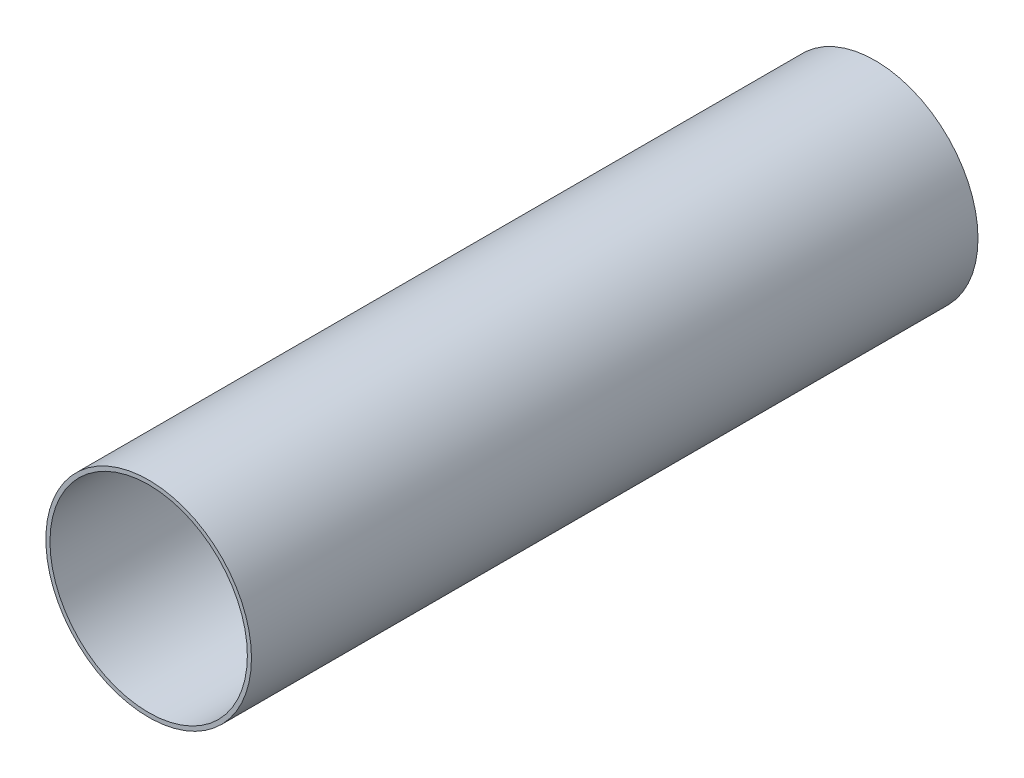
ISO-10303-21;
HEADER;
FILE_DESCRIPTION(('STEP AP214'),'2;1');
FILE_NAME('part.step','',(''),(''),'','','');
FILE_SCHEMA(('AUTOMOTIVE_DESIGN { 1 0 10303 214 1 1 1 1 }'));
ENDSEC;
DATA;
#1=APPLICATION_CONTEXT('core data for automotive mechanical design processes');
#2=APPLICATION_PROTOCOL_DEFINITION('international standard','automotive_design',2000,#1);
#3=PRODUCT_CONTEXT('',#1,'mechanical');
#4=PRODUCT('Part','Part','',(#3));
#5=PRODUCT_RELATED_PRODUCT_CATEGORY('part','',(#4));
#6=PRODUCT_DEFINITION_FORMATION('','',#4);
#7=PRODUCT_DEFINITION_CONTEXT('part definition',#1,'design');
#8=PRODUCT_DEFINITION('design','',#6,#7);
#9=PRODUCT_DEFINITION_SHAPE('','',#8);
#10=(LENGTH_UNIT() NAMED_UNIT(*) SI_UNIT(.MILLI.,.METRE.));
#11=(NAMED_UNIT(*) PLANE_ANGLE_UNIT() SI_UNIT($,.RADIAN.));
#12=(NAMED_UNIT(*) SI_UNIT($,.STERADIAN.) SOLID_ANGLE_UNIT());
#13=UNCERTAINTY_MEASURE_WITH_UNIT(LENGTH_MEASURE(1.E-05),#10,'distance_accuracy_value','');
#14=(GEOMETRIC_REPRESENTATION_CONTEXT(3) GLOBAL_UNCERTAINTY_ASSIGNED_CONTEXT((#13)) GLOBAL_UNIT_ASSIGNED_CONTEXT((#10,
#11,#12)) REPRESENTATION_CONTEXT('',''));
#15=CARTESIAN_POINT('',(0.,0.,0.));
#16=DIRECTION('',(0.,0.,1.));
#17=DIRECTION('',(1.,0.,0.));
#18=AXIS2_PLACEMENT_3D('',#15,#16,#17);
#19=CARTESIAN_POINT('',(-5.32907051820075E-12,6.21724893790088E-12,44.8710883117727));
#20=DIRECTION('',(1.18764013058328E-13,-1.4845501632291E-13,-1.));
#21=DIRECTION('',(0.,1.,-1.4845501632291E-13));
#22=AXIS2_PLACEMENT_3D('',#19,#20,#21);
#23=CYLINDRICAL_SURFACE('',#22,6.35);
#24=CARTESIAN_POINT('',(-5.32907051820075E-12,6.21724893790088E-12,44.8710883117727));
#25=DIRECTION('',(0.,0.,1.));
#26=DIRECTION('',(1.,0.,0.));
#27=AXIS2_PLACEMENT_3D('',#24,#25,#26);
#28=CIRCLE('',#27,6.35);
#29=CARTESIAN_POINT('',(6.34999999999467,6.21724893790088E-12,44.8710883117727));
#30=VERTEX_POINT('',#29);
#31=EDGE_CURVE('E10',#30,#30,#28,.T.);
#32=ORIENTED_EDGE('',*,*,#31,.F.);
#33=EDGE_LOOP('',(#32));
#34=FACE_BOUND('',#33,.T.);
#35=CARTESIAN_POINT('',(0.,-4.44089209850063E-13,0.));
#36=DIRECTION('',(0.,0.,1.));
#37=DIRECTION('',(1.,0.,0.));
#38=AXIS2_PLACEMENT_3D('',#35,#36,#37);
#39=CIRCLE('',#38,6.35);
#40=CARTESIAN_POINT('',(6.35,-4.44089209850063E-13,0.));
#41=VERTEX_POINT('',#40);
#42=EDGE_CURVE('E34',#41,#41,#39,.T.);
#43=ORIENTED_EDGE('',*,*,#42,.T.);
#44=EDGE_LOOP('',(#43));
#45=FACE_BOUND('',#44,.T.);
#46=ADVANCED_FACE('F31',(#34,#45),#23,.T.);
#47=CARTESIAN_POINT('',(-5.32907051820075E-12,6.21724893790088E-12,44.8710883117727));
#48=DIRECTION('',(0.,0.,1.));
#49=DIRECTION('',(1.,0.,0.));
#50=AXIS2_PLACEMENT_3D('',#47,#48,#49);
#51=PLANE('',#50);
#52=CARTESIAN_POINT('',(-5.32907051820075E-12,6.21724893790088E-12,44.8710883117727));
#53=DIRECTION('',(0.,0.,1.));
#54=DIRECTION('',(1.,0.,0.));
#55=AXIS2_PLACEMENT_3D('',#52,#53,#54);
#56=CIRCLE('',#55,6.096);
#57=CARTESIAN_POINT('',(6.09599999999467,6.21724893790088E-12,44.8710883117727));
#58=VERTEX_POINT('',#57);
#59=EDGE_CURVE('E41',#58,#58,#56,.T.);
#60=ORIENTED_EDGE('',*,*,#59,.F.);
#61=EDGE_LOOP('',(#60));
#62=FACE_BOUND('',#61,.T.);
#63=ORIENTED_EDGE('',*,*,#31,.T.);
#64=EDGE_LOOP('',(#63));
#65=FACE_BOUND('',#64,.T.);
#66=ADVANCED_FACE('F52',(#62,#65),#51,.T.);
#67=CARTESIAN_POINT('',(0.,-4.44089209850063E-13,0.));
#68=DIRECTION('',(0.,0.,1.));
#69=DIRECTION('',(1.,0.,0.));
#70=AXIS2_PLACEMENT_3D('',#67,#68,#69);
#71=PLANE('',#70);
#72=CARTESIAN_POINT('',(0.,-4.44089209850063E-13,0.));
#73=DIRECTION('',(0.,0.,1.));
#74=DIRECTION('',(1.,0.,0.));
#75=AXIS2_PLACEMENT_3D('',#72,#73,#74);
#76=CIRCLE('',#75,6.096);
#77=CARTESIAN_POINT('',(6.096,-4.44089209850063E-13,0.));
#78=VERTEX_POINT('',#77);
#79=EDGE_CURVE('E43',#78,#78,#76,.T.);
#80=ORIENTED_EDGE('',*,*,#79,.T.);
#81=EDGE_LOOP('',(#80));
#82=FACE_BOUND('',#81,.T.);
#83=ORIENTED_EDGE('',*,*,#42,.F.);
#84=EDGE_LOOP('',(#83));
#85=FACE_BOUND('',#84,.T.);
#86=ADVANCED_FACE('F54',(#82,#85),#71,.F.);
#87=CARTESIAN_POINT('',(-5.32907051820075E-12,6.21724893790088E-12,44.8710883117727));
#88=DIRECTION('',(1.18764013058328E-13,-1.4845501632291E-13,-1.));
#89=DIRECTION('',(0.,1.,-1.4845501632291E-13));
#90=AXIS2_PLACEMENT_3D('',#87,#88,#89);
#91=CYLINDRICAL_SURFACE('',#90,6.096);
#92=ORIENTED_EDGE('',*,*,#59,.T.);
#93=EDGE_LOOP('',(#92));
#94=FACE_BOUND('',#93,.T.);
#95=ORIENTED_EDGE('',*,*,#79,.F.);
#96=EDGE_LOOP('',(#95));
#97=FACE_BOUND('',#96,.T.);
#98=ADVANCED_FACE('F49',(#94,#97),#91,.F.);
#99=CLOSED_SHELL('',(#46,#66,#86,#98));
#100=MANIFOLD_SOLID_BREP('B2',#99);
#101=ADVANCED_BREP_SHAPE_REPRESENTATION('',(#18,#100),#14);
#102=SHAPE_DEFINITION_REPRESENTATION(#9,#101);
ENDSEC;
END-ISO-10303-21;
